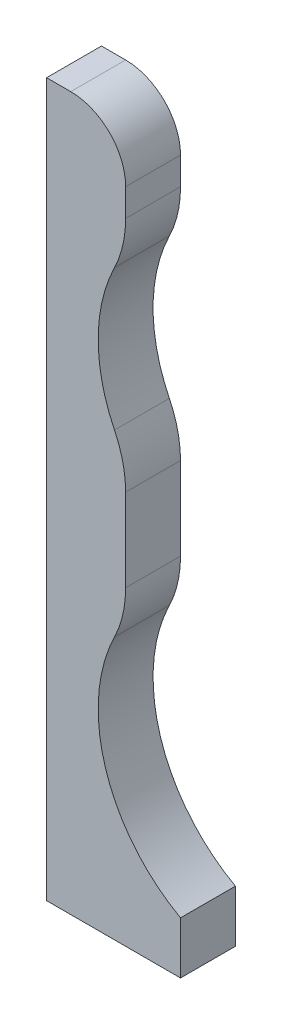
ISO-10303-21;
HEADER;
FILE_DESCRIPTION(('STEP AP214'),'2;1');
FILE_NAME('part.step','',(''),(''),'','','');
FILE_SCHEMA(('AUTOMOTIVE_DESIGN { 1 0 10303 214 1 1 1 1 }'));
ENDSEC;
DATA;
#1=APPLICATION_CONTEXT('core data for automotive mechanical design processes');
#2=APPLICATION_PROTOCOL_DEFINITION('international standard','automotive_design',2000,#1);
#3=PRODUCT_CONTEXT('',#1,'mechanical');
#4=PRODUCT('Part','Part','',(#3));
#5=PRODUCT_RELATED_PRODUCT_CATEGORY('part','',(#4));
#6=PRODUCT_DEFINITION_FORMATION('','',#4);
#7=PRODUCT_DEFINITION_CONTEXT('part definition',#1,'design');
#8=PRODUCT_DEFINITION('design','',#6,#7);
#9=PRODUCT_DEFINITION_SHAPE('','',#8);
#10=(LENGTH_UNIT() NAMED_UNIT(*) SI_UNIT(.MILLI.,.METRE.));
#11=(NAMED_UNIT(*) PLANE_ANGLE_UNIT() SI_UNIT($,.RADIAN.));
#12=(NAMED_UNIT(*) SI_UNIT($,.STERADIAN.) SOLID_ANGLE_UNIT());
#13=UNCERTAINTY_MEASURE_WITH_UNIT(LENGTH_MEASURE(1.E-05),#10,'distance_accuracy_value','');
#14=(GEOMETRIC_REPRESENTATION_CONTEXT(3) GLOBAL_UNCERTAINTY_ASSIGNED_CONTEXT((#13)) GLOBAL_UNIT_ASSIGNED_CONTEXT((#10,
#11,#12)) REPRESENTATION_CONTEXT('',''));
#15=CARTESIAN_POINT('',(0.,0.,0.));
#16=DIRECTION('',(0.,0.,1.));
#17=DIRECTION('',(1.,0.,0.));
#18=AXIS2_PLACEMENT_3D('',#15,#16,#17);
#19=CARTESIAN_POINT('',(3131.52856301299,2664.56001463256,3.175));
#20=DIRECTION('',(0.,0.,-1.));
#21=DIRECTION('',(-1.,0.,0.));
#22=AXIS2_PLACEMENT_3D('',#19,#20,#21);
#23=CYLINDRICAL_SURFACE('',#22,6.35000000000036);
#24=CARTESIAN_POINT('',(3131.52856301299,2664.56001463256,0.));
#25=DIRECTION('',(0.,0.,1.));
#26=DIRECTION('',(1.,0.,0.));
#27=AXIS2_PLACEMENT_3D('',#24,#25,#26);
#28=CIRCLE('',#27,6.35000000000036);
#29=CARTESIAN_POINT('',(3137.2324498669,2661.76928448475,0.));
#30=VERTEX_POINT('',#29);
#31=CARTESIAN_POINT('',(3137.87856301299,2664.56001463263,0.));
#32=VERTEX_POINT('',#31);
#33=EDGE_CURVE('E153',#30,#32,#28,.T.);
#34=ORIENTED_EDGE('',*,*,#33,.T.);
#35=DIRECTION('',(0.,0.,-1.));
#36=VECTOR('',#35,1.);
#37=CARTESIAN_POINT('',(3137.87856301299,2664.56001463263,3.175));
#38=LINE('',#37,#36);
#39=CARTESIAN_POINT('',(3137.87856301299,2664.56001463263,3.175));
#40=VERTEX_POINT('',#39);
#41=EDGE_CURVE('E11',#40,#32,#38,.T.);
#42=ORIENTED_EDGE('',*,*,#41,.F.);
#43=CARTESIAN_POINT('',(3131.52856301299,2664.56001463256,3.175));
#44=DIRECTION('',(0.,0.,1.));
#45=DIRECTION('',(1.,0.,0.));
#46=AXIS2_PLACEMENT_3D('',#43,#44,#45);
#47=CIRCLE('',#46,6.35000000000036);
#48=CARTESIAN_POINT('',(3137.2324498669,2661.76928448475,3.175));
#49=VERTEX_POINT('',#48);
#50=EDGE_CURVE('E175',#49,#40,#47,.T.);
#51=ORIENTED_EDGE('',*,*,#50,.F.);
#52=DIRECTION('',(0.,0.,-1.));
#53=VECTOR('',#52,1.);
#54=CARTESIAN_POINT('',(3137.2324498669,2661.76928448475,3.175));
#55=LINE('',#54,#53);
#56=EDGE_CURVE('E149',#49,#30,#55,.T.);
#57=ORIENTED_EDGE('',*,*,#56,.T.);
#58=EDGE_LOOP('',(#34,#42,#51,#57));
#59=FACE_BOUND('',#58,.T.);
#60=ADVANCED_FACE('F33',(#59),#23,.T.);
#61=CARTESIAN_POINT('',(3137.87856301299,2664.56001463263,3.175));
#62=DIRECTION('',(-1.,0.,0.));
#63=DIRECTION('',(0.,0.,1.));
#64=AXIS2_PLACEMENT_3D('',#61,#62,#63);
#65=PLANE('',#64);
#66=DIRECTION('',(0.,1.,0.));
#67=VECTOR('',#66,1.);
#68=CARTESIAN_POINT('',(3137.87856301299,2664.56001463263,0.));
#69=LINE('',#68,#67);
#70=CARTESIAN_POINT('',(3137.87856301301,2669.350266686,0.));
#71=VERTEX_POINT('',#70);
#72=EDGE_CURVE('E156',#32,#71,#69,.T.);
#73=ORIENTED_EDGE('',*,*,#72,.T.);
#74=DIRECTION('',(0.,0.,-1.));
#75=VECTOR('',#74,1.);
#76=CARTESIAN_POINT('',(3137.87856301301,2669.350266686,3.175));
#77=LINE('',#76,#75);
#78=CARTESIAN_POINT('',(3137.87856301301,2669.350266686,3.175));
#79=VERTEX_POINT('',#78);
#80=EDGE_CURVE('E41',#79,#71,#77,.T.);
#81=ORIENTED_EDGE('',*,*,#80,.F.);
#82=DIRECTION('',(0.,1.,0.));
#83=VECTOR('',#82,1.);
#84=CARTESIAN_POINT('',(3137.87856301299,2664.56001463263,3.175));
#85=LINE('',#84,#83);
#86=EDGE_CURVE('E104',#40,#79,#85,.T.);
#87=ORIENTED_EDGE('',*,*,#86,.F.);
#88=ORIENTED_EDGE('',*,*,#41,.T.);
#89=EDGE_LOOP('',(#73,#81,#87,#88));
#90=FACE_BOUND('',#89,.T.);
#91=ADVANCED_FACE('F253',(#90),#65,.F.);
#92=CARTESIAN_POINT('',(3131.52856301299,2669.350266686,3.175));
#93=DIRECTION('',(0.,0.,-1.));
#94=DIRECTION('',(-1.,0.,0.));
#95=AXIS2_PLACEMENT_3D('',#92,#93,#94);
#96=CYLINDRICAL_SURFACE('',#95,6.35000000001626);
#97=CARTESIAN_POINT('',(3131.52856301299,2669.350266686,0.));
#98=DIRECTION('',(0.,0.,1.));
#99=DIRECTION('',(1.,0.,0.));
#100=AXIS2_PLACEMENT_3D('',#97,#98,#99);
#101=CIRCLE('',#100,6.35000000001626);
#102=CARTESIAN_POINT('',(3137.2324498669,2672.14099683388,0.));
#103=VERTEX_POINT('',#102);
#104=EDGE_CURVE('E158',#71,#103,#101,.T.);
#105=ORIENTED_EDGE('',*,*,#104,.T.);
#106=DIRECTION('',(0.,0.,-1.));
#107=VECTOR('',#106,1.);
#108=CARTESIAN_POINT('',(3137.2324498669,2672.14099683388,3.175));
#109=LINE('',#108,#107);
#110=CARTESIAN_POINT('',(3137.2324498669,2672.14099683388,3.175));
#111=VERTEX_POINT('',#110);
#112=EDGE_CURVE('E194',#111,#103,#109,.T.);
#113=ORIENTED_EDGE('',*,*,#112,.F.);
#114=CARTESIAN_POINT('',(3131.52856301299,2669.350266686,3.175));
#115=DIRECTION('',(0.,0.,1.));
#116=DIRECTION('',(1.,0.,0.));
#117=AXIS2_PLACEMENT_3D('',#114,#115,#116);
#118=CIRCLE('',#117,6.35000000001626);
#119=EDGE_CURVE('E202',#79,#111,#118,.T.);
#120=ORIENTED_EDGE('',*,*,#119,.F.);
#121=ORIENTED_EDGE('',*,*,#80,.T.);
#122=EDGE_LOOP('',(#105,#113,#120,#121));
#123=FACE_BOUND('',#122,.T.);
#124=ADVANCED_FACE('F200',(#123),#96,.T.);
#125=CARTESIAN_POINT('',(3145.54301301299,2676.20709065932,3.175));
#126=DIRECTION('',(0.,0.,-1.));
#127=DIRECTION('',(-1.,0.,0.));
#128=AXIS2_PLACEMENT_3D('',#125,#126,#127);
#129=CYLINDRICAL_SURFACE('',#128,9.25195000000089);
#130=CARTESIAN_POINT('',(3145.54301301299,2676.20709065932,0.));
#131=DIRECTION('',(0.,0.,-1.));
#132=DIRECTION('',(1.,0.,0.));
#133=AXIS2_PLACEMENT_3D('',#130,#131,#132);
#134=CIRCLE('',#133,9.25195000000089);
#135=CARTESIAN_POINT('',(3137.2324498669,2680.27318448475,0.));
#136=VERTEX_POINT('',#135);
#137=EDGE_CURVE('E160',#103,#136,#134,.T.);
#138=ORIENTED_EDGE('',*,*,#137,.T.);
#139=DIRECTION('',(0.,0.,-1.));
#140=VECTOR('',#139,1.);
#141=CARTESIAN_POINT('',(3137.2324498669,2680.27318448475,3.175));
#142=LINE('',#141,#140);
#143=CARTESIAN_POINT('',(3137.2324498669,2680.27318448475,3.175));
#144=VERTEX_POINT('',#143);
#145=EDGE_CURVE('E191',#144,#136,#142,.T.);
#146=ORIENTED_EDGE('',*,*,#145,.F.);
#147=CARTESIAN_POINT('',(3145.54301301299,2676.20709065932,3.175));
#148=DIRECTION('',(0.,0.,-1.));
#149=DIRECTION('',(1.,0.,0.));
#150=AXIS2_PLACEMENT_3D('',#147,#148,#149);
#151=CIRCLE('',#150,9.25195000000089);
#152=EDGE_CURVE('E220',#111,#144,#151,.T.);
#153=ORIENTED_EDGE('',*,*,#152,.F.);
#154=ORIENTED_EDGE('',*,*,#112,.T.);
#155=EDGE_LOOP('',(#138,#146,#153,#154));
#156=FACE_BOUND('',#155,.T.);
#157=ADVANCED_FACE('F211',(#156),#129,.F.);
#158=CARTESIAN_POINT('',(3131.52856301299,2683.06391463256,3.175));
#159=DIRECTION('',(0.,0.,-1.));
#160=DIRECTION('',(-1.,0.,0.));
#161=AXIS2_PLACEMENT_3D('',#158,#159,#160);
#162=CYLINDRICAL_SURFACE('',#161,6.34999999999993);
#163=CARTESIAN_POINT('',(3131.52856301299,2683.06391463256,0.));
#164=DIRECTION('',(0.,0.,1.));
#165=DIRECTION('',(1.,0.,0.));
#166=AXIS2_PLACEMENT_3D('',#163,#164,#165);
#167=CIRCLE('',#166,6.34999999999993);
#168=CARTESIAN_POINT('',(3137.87856301299,2683.06391463263,0.));
#169=VERTEX_POINT('',#168);
#170=EDGE_CURVE('E162',#136,#169,#167,.T.);
#171=ORIENTED_EDGE('',*,*,#170,.T.);
#172=DIRECTION('',(0.,0.,-1.));
#173=VECTOR('',#172,1.);
#174=CARTESIAN_POINT('',(3137.87856301299,2683.06391463263,3.175));
#175=LINE('',#174,#173);
#176=CARTESIAN_POINT('',(3137.87856301299,2683.06391463263,3.175));
#177=VERTEX_POINT('',#176);
#178=EDGE_CURVE('E188',#177,#169,#175,.T.);
#179=ORIENTED_EDGE('',*,*,#178,.F.);
#180=CARTESIAN_POINT('',(3131.52856301299,2683.06391463256,3.175));
#181=DIRECTION('',(0.,0.,1.));
#182=DIRECTION('',(1.,0.,0.));
#183=AXIS2_PLACEMENT_3D('',#180,#181,#182);
#184=CIRCLE('',#183,6.34999999999993);
#185=EDGE_CURVE('E217',#144,#177,#184,.T.);
#186=ORIENTED_EDGE('',*,*,#185,.F.);
#187=ORIENTED_EDGE('',*,*,#145,.T.);
#188=EDGE_LOOP('',(#171,#179,#186,#187));
#189=FACE_BOUND('',#188,.T.);
#190=ADVANCED_FACE('F215',(#189),#162,.T.);
#191=CARTESIAN_POINT('',(3137.87856301299,2683.06391463263,3.175));
#192=DIRECTION('',(-1.,0.,0.));
#193=DIRECTION('',(0.,0.,1.));
#194=AXIS2_PLACEMENT_3D('',#191,#192,#193);
#195=PLANE('',#194);
#196=DIRECTION('',(0.,1.,0.));
#197=VECTOR('',#196,1.);
#198=CARTESIAN_POINT('',(3137.87856301299,2683.06391463263,0.));
#199=LINE('',#198,#197);
#200=CARTESIAN_POINT('',(3137.87856301299,2684.65280416666,0.));
#201=VERTEX_POINT('',#200);
#202=EDGE_CURVE('E164',#169,#201,#199,.T.);
#203=ORIENTED_EDGE('',*,*,#202,.T.);
#204=DIRECTION('',(0.,0.,-1.));
#205=VECTOR('',#204,1.);
#206=CARTESIAN_POINT('',(3137.87856301299,2684.65280416666,3.175));
#207=LINE('',#206,#205);
#208=CARTESIAN_POINT('',(3137.87856301299,2684.65280416666,3.175));
#209=VERTEX_POINT('',#208);
#210=EDGE_CURVE('E185',#209,#201,#207,.T.);
#211=ORIENTED_EDGE('',*,*,#210,.F.);
#212=DIRECTION('',(0.,1.,0.));
#213=VECTOR('',#212,1.);
#214=CARTESIAN_POINT('',(3137.87856301299,2683.06391463263,3.175));
#215=LINE('',#214,#213);
#216=EDGE_CURVE('E219',#177,#209,#215,.T.);
#217=ORIENTED_EDGE('',*,*,#216,.F.);
#218=ORIENTED_EDGE('',*,*,#178,.T.);
#219=EDGE_LOOP('',(#203,#211,#217,#218));
#220=FACE_BOUND('',#219,.T.);
#221=ADVANCED_FACE('F266',(#220),#195,.F.);
#222=CARTESIAN_POINT('',(3134.70356301299,2684.65280416666,3.175));
#223=DIRECTION('',(0.,0.,-1.));
#224=DIRECTION('',(-1.,0.,0.));
#225=AXIS2_PLACEMENT_3D('',#222,#223,#224);
#226=CYLINDRICAL_SURFACE('',#225,3.17499999999993);
#227=CARTESIAN_POINT('',(3134.70356301299,2684.65280416666,0.));
#228=DIRECTION('',(0.,0.,1.));
#229=DIRECTION('',(1.,0.,0.));
#230=AXIS2_PLACEMENT_3D('',#227,#228,#229);
#231=CIRCLE('',#230,3.17499999999993);
#232=CARTESIAN_POINT('',(3134.70356301299,2687.82780416666,0.));
#233=VERTEX_POINT('',#232);
#234=EDGE_CURVE('E166',#201,#233,#231,.T.);
#235=ORIENTED_EDGE('',*,*,#234,.T.);
#236=DIRECTION('',(0.,0.,-1.));
#237=VECTOR('',#236,1.);
#238=CARTESIAN_POINT('',(3134.70356301299,2687.82780416666,3.175));
#239=LINE('',#238,#237);
#240=CARTESIAN_POINT('',(3134.70356301299,2687.82780416666,3.175));
#241=VERTEX_POINT('',#240);
#242=EDGE_CURVE('E182',#241,#233,#239,.T.);
#243=ORIENTED_EDGE('',*,*,#242,.F.);
#244=CARTESIAN_POINT('',(3134.70356301299,2684.65280416666,3.175));
#245=DIRECTION('',(0.,0.,1.));
#246=DIRECTION('',(1.,0.,0.));
#247=AXIS2_PLACEMENT_3D('',#244,#245,#246);
#248=CIRCLE('',#247,3.17499999999993);
#249=EDGE_CURVE('E222',#209,#241,#248,.T.);
#250=ORIENTED_EDGE('',*,*,#249,.F.);
#251=ORIENTED_EDGE('',*,*,#210,.T.);
#252=EDGE_LOOP('',(#235,#243,#250,#251));
#253=FACE_BOUND('',#252,.T.);
#254=ADVANCED_FACE('F269',(#253),#226,.T.);
#255=CARTESIAN_POINT('',(3133.30656301299,2687.82780416666,3.175));
#256=DIRECTION('',(0.,-1.,0.));
#257=DIRECTION('',(0.,0.,-1.));
#258=AXIS2_PLACEMENT_3D('',#255,#256,#257);
#259=PLANE('',#258);
#260=DIRECTION('',(-1.,0.,0.));
#261=VECTOR('',#260,1.);
#262=CARTESIAN_POINT('',(3133.30656301299,2687.82780416666,0.));
#263=LINE('',#262,#261);
#264=CARTESIAN_POINT('',(3133.30656301299,2687.82780416666,0.));
#265=VERTEX_POINT('',#264);
#266=EDGE_CURVE('E168',#233,#265,#263,.T.);
#267=ORIENTED_EDGE('',*,*,#266,.T.);
#268=DIRECTION('',(0.,0.,-1.));
#269=VECTOR('',#268,1.);
#270=CARTESIAN_POINT('',(3133.30656301299,2687.82780416666,3.175));
#271=LINE('',#270,#269);
#272=CARTESIAN_POINT('',(3133.30656301299,2687.82780416666,3.175));
#273=VERTEX_POINT('',#272);
#274=EDGE_CURVE('E179',#273,#265,#271,.T.);
#275=ORIENTED_EDGE('',*,*,#274,.F.);
#276=DIRECTION('',(-1.,0.,0.));
#277=VECTOR('',#276,1.);
#278=CARTESIAN_POINT('',(3133.30656301299,2687.82780416666,3.175));
#279=LINE('',#278,#277);
#280=EDGE_CURVE('E228',#241,#273,#279,.T.);
#281=ORIENTED_EDGE('',*,*,#280,.F.);
#282=ORIENTED_EDGE('',*,*,#242,.T.);
#283=EDGE_LOOP('',(#267,#275,#281,#282));
#284=FACE_BOUND('',#283,.T.);
#285=ADVANCED_FACE('F234',(#284),#259,.F.);
#286=CARTESIAN_POINT('',(3133.30656301299,2687.82780416666,3.175));
#287=DIRECTION('',(1.,0.,0.));
#288=DIRECTION('',(0.,0.,-1.));
#289=AXIS2_PLACEMENT_3D('',#286,#287,#288);
#290=PLANE('',#289);
#291=DIRECTION('',(0.,-1.,0.));
#292=VECTOR('',#291,1.);
#293=CARTESIAN_POINT('',(3133.30656301299,2687.82780416666,0.));
#294=LINE('',#293,#292);
#295=CARTESIAN_POINT('',(3133.30656301299,2646.59954975559,0.));
#296=VERTEX_POINT('',#295);
#297=EDGE_CURVE('E170',#265,#296,#294,.T.);
#298=ORIENTED_EDGE('',*,*,#297,.T.);
#299=DIRECTION('',(0.,0.,-1.));
#300=VECTOR('',#299,1.);
#301=CARTESIAN_POINT('',(3133.30656301299,2646.59954975559,3.175));
#302=LINE('',#301,#300);
#303=CARTESIAN_POINT('',(3133.30656301299,2646.59954975559,3.175));
#304=VERTEX_POINT('',#303);
#305=EDGE_CURVE('E144',#304,#296,#302,.T.);
#306=ORIENTED_EDGE('',*,*,#305,.F.);
#307=DIRECTION('',(0.,-1.,0.));
#308=VECTOR('',#307,1.);
#309=CARTESIAN_POINT('',(3133.30656301299,2687.82780416666,3.175));
#310=LINE('',#309,#308);
#311=EDGE_CURVE('E135',#273,#304,#310,.T.);
#312=ORIENTED_EDGE('',*,*,#311,.F.);
#313=ORIENTED_EDGE('',*,*,#274,.T.);
#314=EDGE_LOOP('',(#298,#306,#312,#313));
#315=FACE_BOUND('',#314,.T.);
#316=ADVANCED_FACE('F238',(#315),#290,.F.);
#317=CARTESIAN_POINT('',(3133.30656301299,2646.59954975559,3.175));
#318=DIRECTION('',(0.,1.,0.));
#319=DIRECTION('',(0.,0.,1.));
#320=AXIS2_PLACEMENT_3D('',#317,#318,#319);
#321=PLANE('',#320);
#322=DIRECTION('',(1.,0.,0.));
#323=VECTOR('',#322,1.);
#324=CARTESIAN_POINT('',(3133.30656301299,2646.59954975559,0.));
#325=LINE('',#324,#323);
#326=CARTESIAN_POINT('',(3141.05356301299,2646.59954975559,0.));
#327=VERTEX_POINT('',#326);
#328=EDGE_CURVE('E143',#296,#327,#325,.T.);
#329=ORIENTED_EDGE('',*,*,#328,.T.);
#330=DIRECTION('',(0.,0.,-1.));
#331=VECTOR('',#330,1.);
#332=CARTESIAN_POINT('',(3141.05356301299,2646.59954975559,3.175));
#333=LINE('',#332,#331);
#334=CARTESIAN_POINT('',(3141.05356301299,2646.59954975559,3.175));
#335=VERTEX_POINT('',#334);
#336=EDGE_CURVE('E140',#335,#327,#333,.T.);
#337=ORIENTED_EDGE('',*,*,#336,.F.);
#338=DIRECTION('',(1.,0.,0.));
#339=VECTOR('',#338,1.);
#340=CARTESIAN_POINT('',(3133.30656301299,2646.59954975559,3.175));
#341=LINE('',#340,#339);
#342=EDGE_CURVE('E129',#304,#335,#341,.T.);
#343=ORIENTED_EDGE('',*,*,#342,.F.);
#344=ORIENTED_EDGE('',*,*,#305,.T.);
#345=EDGE_LOOP('',(#329,#337,#343,#344));
#346=FACE_BOUND('',#345,.T.);
#347=ADVANCED_FACE('F141',(#346),#321,.F.);
#348=CARTESIAN_POINT('',(3141.05356301299,2646.59954975559,3.175));
#349=DIRECTION('',(-1.,-7.95665953423666E-12,0.));
#350=DIRECTION('',(7.95665953423666E-12,-1.,0.));
#351=AXIS2_PLACEMENT_3D('',#348,#349,#350);
#352=PLANE('',#351);
#353=DIRECTION('',(-7.95665953423666E-12,1.,0.));
#354=VECTOR('',#353,1.);
#355=CARTESIAN_POINT('',(3141.05356301299,2646.59954975559,0.));
#356=LINE('',#355,#354);
#357=CARTESIAN_POINT('',(3141.05356301297,2649.613480065,0.));
#358=VERTEX_POINT('',#357);
#359=EDGE_CURVE('E90',#327,#358,#356,.T.);
#360=ORIENTED_EDGE('',*,*,#359,.T.);
#361=DIRECTION('',(0.,0.,-1.));
#362=VECTOR('',#361,1.);
#363=CARTESIAN_POINT('',(3141.05356301297,2649.613480065,3.175));
#364=LINE('',#363,#362);
#365=CARTESIAN_POINT('',(3141.05356301297,2649.613480065,3.175));
#366=VERTEX_POINT('',#365);
#367=EDGE_CURVE('E145',#366,#358,#364,.T.);
#368=ORIENTED_EDGE('',*,*,#367,.F.);
#369=DIRECTION('',(-7.95665953423666E-12,1.,0.));
#370=VECTOR('',#369,1.);
#371=CARTESIAN_POINT('',(3141.05356301299,2646.59954975559,3.175));
#372=LINE('',#371,#370);
#373=EDGE_CURVE('E133',#335,#366,#372,.T.);
#374=ORIENTED_EDGE('',*,*,#373,.F.);
#375=ORIENTED_EDGE('',*,*,#336,.T.);
#376=EDGE_LOOP('',(#360,#368,#374,#375));
#377=FACE_BOUND('',#376,.T.);
#378=ADVANCED_FACE('F147',(#377),#352,.F.);
#379=CARTESIAN_POINT('',(3145.54301301299,2657.70319065932,3.175));
#380=DIRECTION('',(0.,0.,-1.));
#381=DIRECTION('',(-1.,0.,0.));
#382=AXIS2_PLACEMENT_3D('',#379,#380,#381);
#383=CYLINDRICAL_SURFACE('',#382,9.2519500000003);
#384=CARTESIAN_POINT('',(3145.54301301299,2657.70319065932,0.));
#385=DIRECTION('',(0.,0.,-1.));
#386=DIRECTION('',(1.,0.,0.));
#387=AXIS2_PLACEMENT_3D('',#384,#385,#386);
#388=CIRCLE('',#387,9.2519500000003);
#389=EDGE_CURVE('E96',#358,#30,#388,.T.);
#390=ORIENTED_EDGE('',*,*,#389,.T.);
#391=ORIENTED_EDGE('',*,*,#56,.F.);
#392=CARTESIAN_POINT('',(3145.54301301299,2657.70319065932,3.175));
#393=DIRECTION('',(0.,0.,-1.));
#394=DIRECTION('',(1.,0.,0.));
#395=AXIS2_PLACEMENT_3D('',#392,#393,#394);
#396=CIRCLE('',#395,9.2519500000003);
#397=EDGE_CURVE('E49',#366,#49,#396,.T.);
#398=ORIENTED_EDGE('',*,*,#397,.F.);
#399=ORIENTED_EDGE('',*,*,#367,.T.);
#400=EDGE_LOOP('',(#390,#391,#398,#399));
#401=FACE_BOUND('',#400,.T.);
#402=ADVANCED_FACE('F242',(#401),#383,.F.);
#403=CARTESIAN_POINT('',(3131.52856301299,2664.56001463256,3.175));
#404=DIRECTION('',(0.,0.,1.));
#405=DIRECTION('',(1.,0.,0.));
#406=AXIS2_PLACEMENT_3D('',#403,#404,#405);
#407=PLANE('',#406);
#408=ORIENTED_EDGE('',*,*,#50,.T.);
#409=ORIENTED_EDGE('',*,*,#86,.T.);
#410=ORIENTED_EDGE('',*,*,#119,.T.);
#411=ORIENTED_EDGE('',*,*,#152,.T.);
#412=ORIENTED_EDGE('',*,*,#185,.T.);
#413=ORIENTED_EDGE('',*,*,#216,.T.);
#414=ORIENTED_EDGE('',*,*,#249,.T.);
#415=ORIENTED_EDGE('',*,*,#280,.T.);
#416=ORIENTED_EDGE('',*,*,#311,.T.);
#417=ORIENTED_EDGE('',*,*,#342,.T.);
#418=ORIENTED_EDGE('',*,*,#373,.T.);
#419=ORIENTED_EDGE('',*,*,#397,.T.);
#420=EDGE_LOOP('',(#408,#409,#410,#411,#412,#413,#414,#415,#416,#417,#418,#419));
#421=FACE_BOUND('',#420,.T.);
#422=ADVANCED_FACE('F131',(#421),#407,.T.);
#423=CARTESIAN_POINT('',(3131.52856301299,2664.56001463256,0.));
#424=DIRECTION('',(0.,0.,1.));
#425=DIRECTION('',(1.,0.,0.));
#426=AXIS2_PLACEMENT_3D('',#423,#424,#425);
#427=PLANE('',#426);
#428=ORIENTED_EDGE('',*,*,#33,.F.);
#429=ORIENTED_EDGE('',*,*,#389,.F.);
#430=ORIENTED_EDGE('',*,*,#359,.F.);
#431=ORIENTED_EDGE('',*,*,#328,.F.);
#432=ORIENTED_EDGE('',*,*,#297,.F.);
#433=ORIENTED_EDGE('',*,*,#266,.F.);
#434=ORIENTED_EDGE('',*,*,#234,.F.);
#435=ORIENTED_EDGE('',*,*,#202,.F.);
#436=ORIENTED_EDGE('',*,*,#170,.F.);
#437=ORIENTED_EDGE('',*,*,#137,.F.);
#438=ORIENTED_EDGE('',*,*,#104,.F.);
#439=ORIENTED_EDGE('',*,*,#72,.F.);
#440=EDGE_LOOP('',(#428,#429,#430,#431,#432,#433,#434,#435,#436,#437,#438,#439));
#441=FACE_BOUND('',#440,.T.);
#442=ADVANCED_FACE('F206',(#441),#427,.F.);
#443=CLOSED_SHELL('',(#60,#91,#124,#157,#190,#221,#254,#285,#316,#347,#378,#402,#422,#442));
#444=MANIFOLD_SOLID_BREP('B2',#443);
#445=ADVANCED_BREP_SHAPE_REPRESENTATION('',(#18,#444),#14);
#446=SHAPE_DEFINITION_REPRESENTATION(#9,#445);
ENDSEC;
END-ISO-10303-21;
